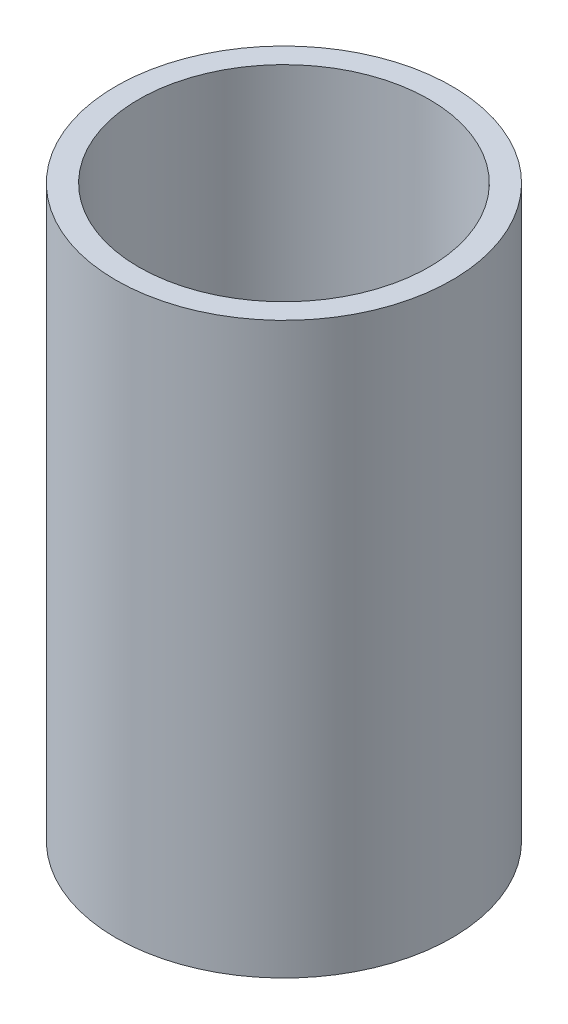
ISO-10303-21;
HEADER;
FILE_DESCRIPTION(('STEP AP214'),'2;1');
FILE_NAME('part.step','',(''),(''),'','','');
FILE_SCHEMA(('AUTOMOTIVE_DESIGN { 1 0 10303 214 1 1 1 1 }'));
ENDSEC;
DATA;
#1=APPLICATION_CONTEXT('core data for automotive mechanical design processes');
#2=APPLICATION_PROTOCOL_DEFINITION('international standard','automotive_design',2000,#1);
#3=PRODUCT_CONTEXT('',#1,'mechanical');
#4=PRODUCT('Part','Part','',(#3));
#5=PRODUCT_RELATED_PRODUCT_CATEGORY('part','',(#4));
#6=PRODUCT_DEFINITION_FORMATION('','',#4);
#7=PRODUCT_DEFINITION_CONTEXT('part definition',#1,'design');
#8=PRODUCT_DEFINITION('design','',#6,#7);
#9=PRODUCT_DEFINITION_SHAPE('','',#8);
#10=(LENGTH_UNIT() NAMED_UNIT(*) SI_UNIT(.MILLI.,.METRE.));
#11=(NAMED_UNIT(*) PLANE_ANGLE_UNIT() SI_UNIT($,.RADIAN.));
#12=(NAMED_UNIT(*) SI_UNIT($,.STERADIAN.) SOLID_ANGLE_UNIT());
#13=UNCERTAINTY_MEASURE_WITH_UNIT(LENGTH_MEASURE(1.E-05),#10,'distance_accuracy_value','');
#14=(GEOMETRIC_REPRESENTATION_CONTEXT(3) GLOBAL_UNCERTAINTY_ASSIGNED_CONTEXT((#13)) GLOBAL_UNIT_ASSIGNED_CONTEXT((#10,
#11,#12)) REPRESENTATION_CONTEXT('',''));
#15=CARTESIAN_POINT('',(0.,0.,0.));
#16=DIRECTION('',(0.,0.,1.));
#17=DIRECTION('',(1.,0.,0.));
#18=AXIS2_PLACEMENT_3D('',#15,#16,#17);
#19=CARTESIAN_POINT('',(0.,10.,0.));
#20=DIRECTION('',(0.,1.,0.));
#21=DIRECTION('',(0.,0.,1.));
#22=AXIS2_PLACEMENT_3D('',#19,#20,#21);
#23=PLANE('',#22);
#24=CARTESIAN_POINT('',(0.,10.,0.));
#25=DIRECTION('',(0.,1.,0.));
#26=DIRECTION('',(0.,0.,1.));
#27=AXIS2_PLACEMENT_3D('',#24,#25,#26);
#28=CIRCLE('',#27,2.95);
#29=CARTESIAN_POINT('',(0.,10.,2.95));
#30=VERTEX_POINT('',#29);
#31=EDGE_CURVE('E10',#30,#30,#28,.T.);
#32=ORIENTED_EDGE('',*,*,#31,.T.);
#33=EDGE_LOOP('',(#32));
#34=FACE_BOUND('',#33,.T.);
#35=CARTESIAN_POINT('',(0.,10.,0.));
#36=DIRECTION('',(0.,1.,0.));
#37=DIRECTION('',(0.,0.,1.));
#38=AXIS2_PLACEMENT_3D('',#35,#36,#37);
#39=CIRCLE('',#38,2.55);
#40=CARTESIAN_POINT('',(0.,10.,2.55));
#41=VERTEX_POINT('',#40);
#42=EDGE_CURVE('E49',#41,#41,#39,.T.);
#43=ORIENTED_EDGE('',*,*,#42,.F.);
#44=EDGE_LOOP('',(#43));
#45=FACE_BOUND('',#44,.T.);
#46=ADVANCED_FACE('F31',(#34,#45),#23,.T.);
#47=CARTESIAN_POINT('',(0.,0.,0.));
#48=DIRECTION('',(0.,1.,0.));
#49=DIRECTION('',(0.,0.,1.));
#50=AXIS2_PLACEMENT_3D('',#47,#48,#49);
#51=PLANE('',#50);
#52=CARTESIAN_POINT('',(0.,0.,0.));
#53=DIRECTION('',(0.,1.,0.));
#54=DIRECTION('',(0.,0.,1.));
#55=AXIS2_PLACEMENT_3D('',#52,#53,#54);
#56=CIRCLE('',#55,2.95);
#57=CARTESIAN_POINT('',(0.,0.,2.95));
#58=VERTEX_POINT('',#57);
#59=EDGE_CURVE('E44',#58,#58,#56,.T.);
#60=ORIENTED_EDGE('',*,*,#59,.F.);
#61=EDGE_LOOP('',(#60));
#62=FACE_BOUND('',#61,.T.);
#63=CARTESIAN_POINT('',(0.,0.,0.));
#64=DIRECTION('',(0.,1.,0.));
#65=DIRECTION('',(0.,0.,1.));
#66=AXIS2_PLACEMENT_3D('',#63,#64,#65);
#67=CIRCLE('',#66,2.55);
#68=CARTESIAN_POINT('',(0.,0.,2.55));
#69=VERTEX_POINT('',#68);
#70=EDGE_CURVE('E51',#69,#69,#67,.T.);
#71=ORIENTED_EDGE('',*,*,#70,.T.);
#72=EDGE_LOOP('',(#71));
#73=FACE_BOUND('',#72,.T.);
#74=ADVANCED_FACE('F71',(#62,#73),#51,.F.);
#75=CARTESIAN_POINT('',(0.,10.,0.));
#76=DIRECTION('',(0.,-1.,0.));
#77=DIRECTION('',(0.,0.,-1.));
#78=AXIS2_PLACEMENT_3D('',#75,#76,#77);
#79=CYLINDRICAL_SURFACE('',#78,2.95);
#80=CARTESIAN_POINT('',(0.,5.5,-2.95));
#81=CARTESIAN_POINT('',(-0.0786967343503099,5.49999496128407,-2.94999559444045));
#82=CARTESIAN_POINT('',(-0.157482446479922,5.49377050020725,-2.94681741484867));
#83=CARTESIAN_POINT('',(-0.312715144182025,5.46915276846947,-2.93441666615241));
#84=CARTESIAN_POINT('',(-0.389157626702823,5.45073743782359,-2.92518313988091));
#85=CARTESIAN_POINT('',(-0.537223423951205,5.40264971471117,-2.90163573698355));
#86=CARTESIAN_POINT('',(-0.608864389643726,5.37302155591406,-2.88734183722876));
#87=CARTESIAN_POINT('',(-0.746046739389002,5.30358372535319,-2.85497614699634));
#88=CARTESIAN_POINT('',(-0.811588470566977,5.26377463349994,-2.8369045717075));
#89=CARTESIAN_POINT('',(-0.939278100980876,5.17230594592555,-2.79731963304206));
#90=CARTESIAN_POINT('',(-1.00096431002571,5.12006504735515,-2.77566241584188));
#91=CARTESIAN_POINT('',(-1.11512740958132,5.00647106673273,-2.73180123324872));
#92=CARTESIAN_POINT('',(-1.16759702363543,4.94511085495063,-2.70959685150118));
#93=CARTESIAN_POINT('',(-1.26609937555653,4.80907386037746,-2.66507891365735));
#94=CARTESIAN_POINT('',(-1.31126800314006,4.73372136624097,-2.64290184026162));
#95=CARTESIAN_POINT('',(-1.38810120588266,4.57524994512281,-2.6033735872767));
#96=CARTESIAN_POINT('',(-1.41977565835824,4.49213675324823,-2.58601888111182));
#97=CARTESIAN_POINT('',(-1.46662160804149,4.32562902753656,-2.5597281341455));
#98=CARTESIAN_POINT('',(-1.48267800645396,4.24255769930908,-2.5503450854194));
#99=CARTESIAN_POINT('',(-1.50052972313779,4.07441497715931,-2.53988787731173));
#100=CARTESIAN_POINT('',(-1.50234002835121,3.9893457795557,-2.53880498616527));
#101=CARTESIAN_POINT('',(-1.49229623961063,3.83104080948976,-2.54471334665691));
#102=CARTESIAN_POINT('',(-1.48211829616227,3.7576524914365,-2.55071438482073));
#103=CARTESIAN_POINT('',(-1.45130098512133,3.61381642615021,-2.56837257787448));
#104=CARTESIAN_POINT('',(-1.43065808791739,3.54336967973067,-2.5800316410419));
#105=CARTESIAN_POINT('',(-1.37913281800187,3.40540334866354,-2.60794245242824));
#106=CARTESIAN_POINT('',(-1.34802405139281,3.33798955731611,-2.62429445325893));
#107=CARTESIAN_POINT('',(-1.27662645182652,3.2090101877422,-2.65975794379144));
#108=CARTESIAN_POINT('',(-1.23633349184822,3.14744725634189,-2.67887067263897));
#109=CARTESIAN_POINT('',(-1.14152655141021,3.0233796141991,-2.720742402698));
#110=CARTESIAN_POINT('',(-1.08583843699796,2.96181910757113,-2.74365007033312));
#111=CARTESIAN_POINT('',(-0.964854013047626,2.84850957506803,-2.78849783807758));
#112=CARTESIAN_POINT('',(-0.899552837117743,2.79676554910469,-2.81043744077174));
#113=CARTESIAN_POINT('',(-0.757110146833941,2.70213785218609,-2.85220150174813));
#114=CARTESIAN_POINT('',(-0.679542307340964,2.6598201600495,-2.87186731723045));
#115=CARTESIAN_POINT('',(-0.517136832773198,2.58918746231084,-2.90549878435036));
#116=CARTESIAN_POINT('',(-0.43230522089248,2.56086098449133,-2.91946910441195));
#117=CARTESIAN_POINT('',(-0.265479508151909,2.52140811813671,-2.93912722181314));
#118=CARTESIAN_POINT('',(-0.183853422336868,2.50902835406068,-2.94541620269777));
#119=CARTESIAN_POINT('',(-0.0194528984196289,2.49786848219414,-2.95107992232452));
#120=CARTESIAN_POINT('',(0.0633209468424048,2.49908159692125,-2.95045810682808));
#121=CARTESIAN_POINT('',(0.22055240616506,2.51437213845809,-2.94271229132657));
#122=CARTESIAN_POINT('',(0.295141803862749,2.52740281017154,-2.93611742344697));
#123=CARTESIAN_POINT('',(0.440917586201834,2.5642958686516,-2.91778867207367));
#124=CARTESIAN_POINT('',(0.512103600366814,2.58815943168218,-2.90605423051633));
#125=CARTESIAN_POINT('',(0.651355432573476,2.6466339656108,-2.87809368649659));
#126=CARTESIAN_POINT('',(0.719279350205532,2.68152546275042,-2.8617517068607));
#127=CARTESIAN_POINT('',(0.848526605081856,2.76074419734266,-2.8261287852623));
#128=CARTESIAN_POINT('',(0.909847161137473,2.80507538736057,-2.8068466131527));
#129=CARTESIAN_POINT('',(1.03070145821651,2.90705912180013,-2.7648953424917));
#130=CARTESIAN_POINT('',(1.08943325788574,2.96560364521646,-2.74208071774784));
#131=CARTESIAN_POINT('',(1.19661414326487,3.09172106331129,-2.69703569069541));
#132=CARTESIAN_POINT('',(1.2450555123541,3.15930067180847,-2.67480573769041));
#133=CARTESIAN_POINT('',(1.33271643617878,3.306062328934,-2.63227429473153));
#134=CARTESIAN_POINT('',(1.3713115576516,3.3856693536658,-2.6121373394608));
#135=CARTESIAN_POINT('',(1.43414563496893,3.55159361350441,-2.57818152423995));
#136=CARTESIAN_POINT('',(1.45840367499579,3.63790175468052,-2.56435427102095));
#137=CARTESIAN_POINT('',(1.48958905707633,3.80584784279696,-2.5463542377916));
#138=CARTESIAN_POINT('',(1.49796824146672,3.8871276727941,-2.54137562204879));
#139=CARTESIAN_POINT('',(1.50137389059341,4.05004889787086,-2.53936711597553));
#140=CARTESIAN_POINT('',(1.49640684001812,4.13169009812281,-2.54233336538003));
#141=CARTESIAN_POINT('',(1.47462944318993,4.28425285186549,-2.55501383744185));
#142=CARTESIAN_POINT('',(1.4590734103465,4.35542088399737,-2.56401198290951));
#143=CARTESIAN_POINT('',(1.41814848099537,4.49404611942546,-2.58687087210395));
#144=CARTESIAN_POINT('',(1.39277633539327,4.56150208558934,-2.60073322572287));
#145=CARTESIAN_POINT('',(1.33105008849413,4.69579377058162,-2.6328863601159));
#146=CARTESIAN_POINT('',(1.29407498770488,4.76228626306226,-2.6514113135299));
#147=CARTESIAN_POINT('',(1.2108602685606,4.88856181230183,-2.69043287749404));
#148=CARTESIAN_POINT('',(1.16461575211751,4.94834129564611,-2.71093052745487));
#149=CARTESIAN_POINT('',(1.05728454884209,5.06740928460702,-2.75470812521749));
#150=CARTESIAN_POINT('',(0.995058123443852,5.12566789409223,-2.77801029832032));
#151=CARTESIAN_POINT('',(0.861099921295228,5.23116839861042,-2.8224073042191));
#152=CARTESIAN_POINT('',(0.789362835449916,5.27840409942176,-2.84350089226843));
#153=CARTESIAN_POINT('',(0.637104537524569,5.36076086419338,-2.88146124915088));
#154=CARTESIAN_POINT('',(0.556495686026596,5.39574350949117,-2.8982791695842));
#155=CARTESIAN_POINT('',(0.389522457326954,5.45119342089724,-2.92538376116296));
#156=CARTESIAN_POINT('',(0.303174962834286,5.47170136775333,-2.93568872818504));
#157=CARTESIAN_POINT('',(0.179916071337362,5.48960901207659,-2.94472774139551));
#158=CARTESIAN_POINT('',(0.14407898177165,5.4934997042758,-2.94669929185848));
#159=CARTESIAN_POINT('',(0.0721675044238196,5.49869638842721,-2.94933644897762));
#160=CARTESIAN_POINT('',(0.036093110292094,5.50000231093363,-2.95000202054568));
#161=CARTESIAN_POINT('',(0.,5.5,-2.95));
#162=B_SPLINE_CURVE_WITH_KNOTS('',3,(#80,#81,#82,#83,#84,#85,#86,#87,#88,#89,#90,#91,#92,#93,
#94,#95,#96,#97,#98,#99,#100,#101,#102,#103,#104,#105,#106,#107,#108,#109,#110,#111,#112,#113,
#114,#115,#116,#117,#118,#119,#120,#121,#122,#123,#124,#125,#126,#127,#128,#129,#130,#131,#132,
#133,#134,#135,#136,#137,#138,#139,#140,#141,#142,#143,#144,#145,#146,#147,#148,#149,#150,#151,
#152,#153,#154,#155,#156,#157,#158,#159,#160,#161),.UNSPECIFIED.,.T.,.F.,(4,2,2,2,2,2,2,2,2,2,2,
2,2,2,2,2,2,2,2,2,2,2,2,2,2,2,2,2,2,2,2,2,2,2,2,2,2,2,2,2,4),(0.,0.235943976626285,
0.472316076966521,0.707765268088207,0.943201050904171,1.19322016004746,1.44343577945048,
1.7138932280046,1.98415236856085,2.23800942629396,2.49159938972737,2.71355996079347,
2.9355954444026,3.16278092880092,3.39006870353125,3.64729673840842,3.90465543973482,
4.1747645382864,4.44465178933987,4.69168514632822,4.9385953366413,5.16556655157425,
5.39256241753889,5.6258733715497,5.85928220973557,6.1161984315921,6.37330663577634,
6.644034505488,6.91440119117928,7.15856353823403,7.40260727278137,7.62186068511773,
7.84118673163861,8.07518171568931,8.30930067345639,8.57320286257479,8.8372529938899,
9.10419647639519,9.37038670147211,9.47859606047617,9.58680832673388),.UNSPECIFIED.);
#163=CARTESIAN_POINT('',(0.,5.5,-2.95));
#164=VERTEX_POINT('',#163);
#165=EDGE_CURVE('E54',#164,#164,#162,.T.);
#166=ORIENTED_EDGE('',*,*,#165,.T.);
#167=EDGE_LOOP('',(#166));
#168=FACE_BOUND('',#167,.T.);
#169=ORIENTED_EDGE('',*,*,#31,.F.);
#170=EDGE_LOOP('',(#169));
#171=FACE_BOUND('',#170,.T.);
#172=ORIENTED_EDGE('',*,*,#59,.T.);
#173=EDGE_LOOP('',(#172));
#174=FACE_BOUND('',#173,.T.);
#175=ADVANCED_FACE('F33',(#168,#171,#174),#79,.T.);
#176=CARTESIAN_POINT('',(0.,10.,0.));
#177=DIRECTION('',(0.,-1.,0.));
#178=DIRECTION('',(0.,0.,-1.));
#179=AXIS2_PLACEMENT_3D('',#176,#177,#178);
#180=CYLINDRICAL_SURFACE('',#179,2.55);
#181=CARTESIAN_POINT('',(0.,5.5,-2.55));
#182=CARTESIAN_POINT('',(-0.0769834030141568,5.49999305647011,-2.54999387035735));
#183=CARTESIAN_POINT('',(-0.154080738715479,5.49403263951308,-2.54647563661658));
#184=CARTESIAN_POINT('',(-0.305988071752013,5.4704802761875,-2.53273068444616));
#185=CARTESIAN_POINT('',(-0.380791309668883,5.45285687564281,-2.52248582541092));
#186=CARTESIAN_POINT('',(-0.52556033017075,5.40695550441227,-2.4963314487874));
#187=CARTESIAN_POINT('',(-0.595548040963552,5.37873021887599,-2.48044996308686));
#188=CARTESIAN_POINT('',(-0.729584144287755,5.31274236831428,-2.44438756592114));
#189=CARTESIAN_POINT('',(-0.793634394817821,5.27498280070172,-2.42420800600732));
#190=CARTESIAN_POINT('',(-0.919402380549692,5.18784801935919,-2.37949140166581));
#191=CARTESIAN_POINT('',(-0.98058742935454,5.13781529645388,-2.35474133963835));
#192=CARTESIAN_POINT('',(-1.09421823149642,5.02902145094267,-2.30414066088766));
#193=CARTESIAN_POINT('',(-1.14665287241768,4.97024940634232,-2.27828869631908));
#194=CARTESIAN_POINT('',(-1.24749478317438,4.83755096194133,-2.2248319436702));
#195=CARTESIAN_POINT('',(-1.29471676144252,4.76265635360476,-2.19737499092928));
#196=CARTESIAN_POINT('',(-1.37571426185691,4.60438360086915,-2.14759890003646));
#197=CARTESIAN_POINT('',(-1.40951108427838,4.52101916073593,-2.12527164705871));
#198=CARTESIAN_POINT('',(-1.45580562683429,4.36802760580293,-2.09373450246308));
#199=CARTESIAN_POINT('',(-1.47143194210528,4.29972863725244,-2.08268004780358));
#200=CARTESIAN_POINT('',(-1.49299295521335,4.16090685511082,-2.06728200150309));
#201=CARTESIAN_POINT('',(-1.49893898779593,4.09038674109623,-2.06293056155309));
#202=CARTESIAN_POINT('',(-1.50080215754229,3.94902235799851,-2.06157584084914));
#203=CARTESIAN_POINT('',(-1.49670226641141,3.8781777419751,-2.06458503669051));
#204=CARTESIAN_POINT('',(-1.47869205783705,3.73837913942275,-2.07751933261925));
#205=CARTESIAN_POINT('',(-1.46477461507524,3.66942656387029,-2.08744945566909));
#206=CARTESIAN_POINT('',(-1.42801413511205,3.53573161303157,-2.11276166033829));
#207=CARTESIAN_POINT('',(-1.40525174560248,3.47095719375109,-2.12809436699916));
#208=CARTESIAN_POINT('',(-1.35161631328246,3.34596271162587,-2.16255575970916));
#209=CARTESIAN_POINT('',(-1.32074024232772,3.28574436000153,-2.18168586234846));
#210=CARTESIAN_POINT('',(-1.24573661936821,3.160767484047,-2.22549474173058));
#211=CARTESIAN_POINT('',(-1.20025168396159,3.09696007803331,-2.2505649557596));
#212=CARTESIAN_POINT('',(-1.10003158527549,2.97724219303753,-2.30121457499646));
#213=CARTESIAN_POINT('',(-1.04528795389733,2.92133903007647,-2.32679442725825));
#214=CARTESIAN_POINT('',(-0.919720494179616,2.81175966088491,-2.37945754425591));
#215=CARTESIAN_POINT('',(-0.847734507046057,2.75929101121998,-2.40631213423717));
#216=CARTESIAN_POINT('',(-0.694325156730877,2.66737418534773,-2.45496876805585));
#217=CARTESIAN_POINT('',(-0.612907321660724,2.62791843378669,-2.47677374927234));
#218=CARTESIAN_POINT('',(-0.448394302778248,2.56607453199957,-2.51157991748809));
#219=CARTESIAN_POINT('',(-0.365765023144961,2.54273127118912,-2.52506743129572));
#220=CARTESIAN_POINT('',(-0.196855892123347,2.5104979960945,-2.54380401779276));
#221=CARTESIAN_POINT('',(-0.110580191326312,2.50159198005491,-2.54906221135954));
#222=CARTESIAN_POINT('',(0.0510240412017221,2.49897886763114,-2.55060183239036));
#223=CARTESIAN_POINT('',(0.126320077288285,2.50344915602648,-2.54795976191143));
#224=CARTESIAN_POINT('',(0.274893342145768,2.52350059343705,-2.53623415575386));
#225=CARTESIAN_POINT('',(0.348170577099097,2.53908170842237,-2.5271506398039));
#226=CARTESIAN_POINT('',(0.489432912575393,2.58022011646155,-2.50359699830453));
#227=CARTESIAN_POINT('',(0.557489977087735,2.60559100506705,-2.48922774267965));
#228=CARTESIAN_POINT('',(0.688392431065789,2.66534742964627,-2.45625272213017));
#229=CARTESIAN_POINT('',(0.751236700571292,2.69973489624697,-2.43764605000351));
#230=CARTESIAN_POINT('',(0.877001740602612,2.78056377447077,-2.39545674361377));
#231=CARTESIAN_POINT('',(0.939247573108745,2.82788805390476,-2.37155759069325));
#232=CARTESIAN_POINT('',(1.0553938278062,2.9312626202959,-2.32220483457066));
#233=CARTESIAN_POINT('',(1.10928437329511,2.98732307966281,-2.29674944054839));
#234=CARTESIAN_POINT('',(1.21397151779752,3.1146322553688,-2.24335265489331));
#235=CARTESIAN_POINT('',(1.26357641029115,3.18690062926304,-2.21548964060279));
#236=CARTESIAN_POINT('',(1.34990824467973,3.34010989116431,-2.16397356287028));
#237=CARTESIAN_POINT('',(1.38665045619508,3.42104034607036,-2.14031552413852));
#238=CARTESIAN_POINT('',(1.43923724484973,3.57162065747276,-2.10520147710431));
#239=CARTESIAN_POINT('',(1.45788116804141,3.6399326370745,-2.09221373738061));
#240=CARTESIAN_POINT('',(1.48538105390894,3.77937163703656,-2.07278415850345));
#241=CARTESIAN_POINT('',(1.49424961350519,3.85049491186283,-2.06633389576378));
#242=CARTESIAN_POINT('',(1.50170641739174,3.99378901348532,-2.06092275748992));
#243=CARTESIAN_POINT('',(1.50026401354796,4.06596232639924,-2.06198420955656));
#244=CARTESIAN_POINT('',(1.48711896342983,4.20888846113023,-2.07148200448262));
#245=CARTESIAN_POINT('',(1.47541021259241,4.27964041217023,-2.07992273519122));
#246=CARTESIAN_POINT('',(1.44297451598014,4.41536757448846,-2.10254444190978));
#247=CARTESIAN_POINT('',(1.42257432646869,4.48045802275673,-2.11651624399681));
#248=CARTESIAN_POINT('',(1.37362978936694,4.60639180437892,-2.14860304470618));
#249=CARTESIAN_POINT('',(1.34508237845748,4.66723352950149,-2.16671960122865));
#250=CARTESIAN_POINT('',(1.27556399815447,4.79301283334544,-2.20846555885449));
#251=CARTESIAN_POINT('',(1.23335371373445,4.85712554734134,-2.23251421426608));
#252=CARTESIAN_POINT('',(1.13990637146667,4.97798659627646,-2.28164535065153));
#253=CARTESIAN_POINT('',(1.0886620979585,5.03472898096401,-2.3067286456561));
#254=CARTESIAN_POINT('',(0.969700782287508,5.14776186522093,-2.35944954757615));
#255=CARTESIAN_POINT('',(0.900669724332884,5.20276153437481,-2.38692110363536));
#256=CARTESIAN_POINT('',(0.752877740499425,5.30039263232039,-2.43757688031253));
#257=CARTESIAN_POINT('',(0.674114232915796,5.34302076925835,-2.46075995924592));
#258=CARTESIAN_POINT('',(0.512190123597189,5.41246457697444,-2.49935075748825));
#259=CARTESIAN_POINT('',(0.429362816800278,5.43987982498875,-2.51504921896699));
#260=CARTESIAN_POINT('',(0.301925970507377,5.46994976205703,-2.53242813061777));
#261=CARTESIAN_POINT('',(0.258964221833943,5.47812792421287,-2.53719107765704));
#262=CARTESIAN_POINT('',(0.172316904488786,5.49070966003075,-2.54454057656616));
#263=CARTESIAN_POINT('',(0.128631928880241,5.49511618405202,-2.54712882955859));
#264=CARTESIAN_POINT('',(0.056587162829942,5.49920048980433,-2.54952984390426));
#265=CARTESIAN_POINT('',(0.0283012804501664,5.50000255263835,-2.55000225343034));
#266=CARTESIAN_POINT('',(0.,5.5,-2.55));
#267=B_SPLINE_CURVE_WITH_KNOTS('',3,(#181,#182,#183,#184,#185,#186,#187,#188,#189,#190,#191,
#192,#193,#194,#195,#196,#197,#198,#199,#200,#201,#202,#203,#204,#205,#206,#207,#208,#209,#210,
#211,#212,#213,#214,#215,#216,#217,#218,#219,#220,#221,#222,#223,#224,#225,#226,#227,#228,#229,
#230,#231,#232,#233,#234,#235,#236,#237,#238,#239,#240,#241,#242,#243,#244,#245,#246,#247,#248,
#249,#250,#251,#252,#253,#254,#255,#256,#257,#258,#259,#260,#261,#262,#263,#264,#265,#266),
.UNSPECIFIED.,.T.,.F.,(4,2,2,2,2,2,2,2,2,2,2,2,2,2,2,2,2,2,2,2,2,2,2,2,2,2,2,2,2,2,2,2,2,2,2,2,
2,2,2,2,2,2,4),(0.,0.230847911194792,0.462320952638294,0.692658608526363,0.922923940217465,
1.17041022990823,1.41820845712606,1.69494294984758,1.97123660653237,2.18311896538283,
2.39475305003309,2.6067461121022,2.8188931916183,3.02914967605461,3.23948474300204,
3.48534662632937,3.73143460569539,4.00911975436257,4.28664296435034,4.54583751546863,
4.80474458717324,5.0300486477856,5.25535201834648,5.47656177188382,5.69781892952158,
5.94214074966275,6.18674921368707,6.46138224922345,6.73568814634575,6.95076024915889,
7.16555487635177,7.38098822038327,7.59654975207341,7.80463729569848,8.01280318263025,
8.25320656340152,8.49380283725281,8.76974228162622,9.04575508160466,9.30993429620334,
9.44172931322151,9.5734211392821,9.65828737304495),.UNSPECIFIED.);
#268=CARTESIAN_POINT('',(0.,5.5,-2.55));
#269=VERTEX_POINT('',#268);
#270=EDGE_CURVE('E36',#269,#269,#267,.T.);
#271=ORIENTED_EDGE('',*,*,#270,.F.);
#272=EDGE_LOOP('',(#271));
#273=FACE_BOUND('',#272,.T.);
#274=ORIENTED_EDGE('',*,*,#42,.T.);
#275=EDGE_LOOP('',(#274));
#276=FACE_BOUND('',#275,.T.);
#277=ORIENTED_EDGE('',*,*,#70,.F.);
#278=EDGE_LOOP('',(#277));
#279=FACE_BOUND('',#278,.T.);
#280=ADVANCED_FACE('F63',(#273,#276,#279),#180,.F.);
#281=CARTESIAN_POINT('',(0.,4.,-10.));
#282=DIRECTION('',(0.,0.,1.));
#283=DIRECTION('',(1.,0.,0.));
#284=AXIS2_PLACEMENT_3D('',#281,#282,#283);
#285=CYLINDRICAL_SURFACE('',#284,1.5);
#286=ORIENTED_EDGE('',*,*,#270,.T.);
#287=EDGE_LOOP('',(#286));
#288=FACE_BOUND('',#287,.T.);
#289=ORIENTED_EDGE('',*,*,#165,.F.);
#290=EDGE_LOOP('',(#289));
#291=FACE_BOUND('',#290,.T.);
#292=ADVANCED_FACE('F60',(#288,#291),#285,.F.);
#293=CLOSED_SHELL('',(#46,#74,#175,#280,#292));
#294=MANIFOLD_SOLID_BREP('B2',#293);
#295=ADVANCED_BREP_SHAPE_REPRESENTATION('',(#18,#294),#14);
#296=SHAPE_DEFINITION_REPRESENTATION(#9,#295);
ENDSEC;
END-ISO-10303-21;
